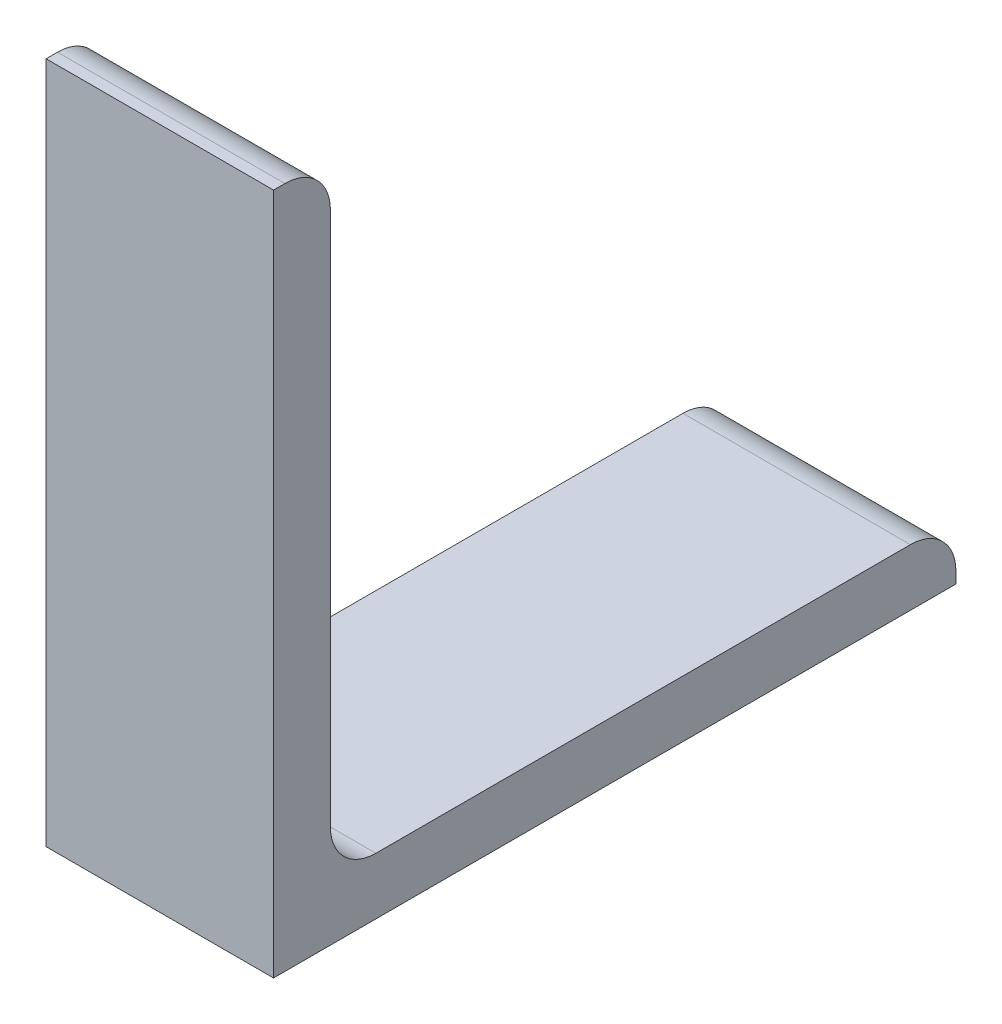
ISO-10303-21;
HEADER;
FILE_DESCRIPTION(('STEP AP214'),'2;1');
FILE_NAME('part.step','',(''),(''),'','','');
FILE_SCHEMA(('AUTOMOTIVE_DESIGN { 1 0 10303 214 1 1 1 1 }'));
ENDSEC;
DATA;
#1=APPLICATION_CONTEXT('core data for automotive mechanical design processes');
#2=APPLICATION_PROTOCOL_DEFINITION('international standard','automotive_design',2000,#1);
#3=PRODUCT_CONTEXT('',#1,'mechanical');
#4=PRODUCT('Part','Part','',(#3));
#5=PRODUCT_RELATED_PRODUCT_CATEGORY('part','',(#4));
#6=PRODUCT_DEFINITION_FORMATION('','',#4);
#7=PRODUCT_DEFINITION_CONTEXT('part definition',#1,'design');
#8=PRODUCT_DEFINITION('design','',#6,#7);
#9=PRODUCT_DEFINITION_SHAPE('','',#8);
#10=(LENGTH_UNIT() NAMED_UNIT(*) SI_UNIT(.MILLI.,.METRE.));
#11=(NAMED_UNIT(*) PLANE_ANGLE_UNIT() SI_UNIT($,.RADIAN.));
#12=(NAMED_UNIT(*) SI_UNIT($,.STERADIAN.) SOLID_ANGLE_UNIT());
#13=UNCERTAINTY_MEASURE_WITH_UNIT(LENGTH_MEASURE(1.E-05),#10,'distance_accuracy_value','');
#14=(GEOMETRIC_REPRESENTATION_CONTEXT(3) GLOBAL_UNCERTAINTY_ASSIGNED_CONTEXT((#13)) GLOBAL_UNIT_ASSIGNED_CONTEXT((#10,
#11,#12)) REPRESENTATION_CONTEXT('',''));
#15=CARTESIAN_POINT('',(0.,0.,0.));
#16=DIRECTION('',(0.,0.,1.));
#17=DIRECTION('',(1.,0.,0.));
#18=AXIS2_PLACEMENT_3D('',#15,#16,#17);
#19=CARTESIAN_POINT('',(-12.7,76.2,0.));
#20=DIRECTION('',(0.,1.,0.));
#21=DIRECTION('',(0.,0.,1.));
#22=AXIS2_PLACEMENT_3D('',#19,#20,#21);
#23=PLANE('',#22);
#24=DIRECTION('',(1.,0.,0.));
#25=VECTOR('',#24,1.);
#26=CARTESIAN_POINT('',(-12.7,76.2,0.));
#27=LINE('',#26,#25);
#28=CARTESIAN_POINT('',(-12.7,76.2,0.));
#29=VERTEX_POINT('',#28);
#30=CARTESIAN_POINT('',(12.7,76.2,0.));
#31=VERTEX_POINT('',#30);
#32=EDGE_CURVE('E35',#29,#31,#27,.T.);
#33=ORIENTED_EDGE('',*,*,#32,.T.);
#34=DIRECTION('',(0.,0.,1.));
#35=VECTOR('',#34,1.);
#36=CARTESIAN_POINT('',(12.7,76.2,0.));
#37=LINE('',#36,#35);
#38=CARTESIAN_POINT('',(12.7,76.2,-1.26999999999996));
#39=VERTEX_POINT('',#38);
#40=EDGE_CURVE('E102',#39,#31,#37,.T.);
#41=ORIENTED_EDGE('',*,*,#40,.F.);
#42=DIRECTION('',(1.,0.,0.));
#43=VECTOR('',#42,1.);
#44=CARTESIAN_POINT('',(-12.7,76.2,-1.26999999999996));
#45=LINE('',#44,#43);
#46=CARTESIAN_POINT('',(-12.7,76.2,-1.26999999999996));
#47=VERTEX_POINT('',#46);
#48=EDGE_CURVE('E11',#47,#39,#45,.T.);
#49=ORIENTED_EDGE('',*,*,#48,.F.);
#50=DIRECTION('',(0.,0.,1.));
#51=VECTOR('',#50,1.);
#52=CARTESIAN_POINT('',(-12.7,76.2,0.));
#53=LINE('',#52,#51);
#54=EDGE_CURVE('E103',#47,#29,#53,.T.);
#55=ORIENTED_EDGE('',*,*,#54,.T.);
#56=EDGE_LOOP('',(#33,#41,#49,#55));
#57=FACE_BOUND('',#56,.T.);
#58=ADVANCED_FACE('F32',(#57),#23,.T.);
#59=CARTESIAN_POINT('',(-12.7,71.12,-1.27));
#60=DIRECTION('',(1.,0.,0.));
#61=DIRECTION('',(0.,0.,-1.));
#62=AXIS2_PLACEMENT_3D('',#59,#60,#61);
#63=CYLINDRICAL_SURFACE('',#62,5.08);
#64=ORIENTED_EDGE('',*,*,#48,.T.);
#65=CARTESIAN_POINT('',(12.7,71.12,-1.27));
#66=DIRECTION('',(1.,0.,0.));
#67=DIRECTION('',(0.,0.,-1.));
#68=AXIS2_PLACEMENT_3D('',#65,#66,#67);
#69=CIRCLE('',#68,5.08);
#70=CARTESIAN_POINT('',(12.7,71.12,-6.35));
#71=VERTEX_POINT('',#70);
#72=EDGE_CURVE('E120',#71,#39,#69,.T.);
#73=ORIENTED_EDGE('',*,*,#72,.F.);
#74=DIRECTION('',(1.,0.,0.));
#75=VECTOR('',#74,1.);
#76=CARTESIAN_POINT('',(-12.7,71.12,-6.35));
#77=LINE('',#76,#75);
#78=CARTESIAN_POINT('',(-12.7,71.12,-6.35));
#79=VERTEX_POINT('',#78);
#80=EDGE_CURVE('E40',#79,#71,#77,.T.);
#81=ORIENTED_EDGE('',*,*,#80,.F.);
#82=CARTESIAN_POINT('',(-12.7,71.12,-1.27));
#83=DIRECTION('',(1.,0.,0.));
#84=DIRECTION('',(0.,0.,-1.));
#85=AXIS2_PLACEMENT_3D('',#82,#83,#84);
#86=CIRCLE('',#85,5.08);
#87=EDGE_CURVE('E108',#79,#47,#86,.T.);
#88=ORIENTED_EDGE('',*,*,#87,.T.);
#89=EDGE_LOOP('',(#64,#73,#81,#88));
#90=FACE_BOUND('',#89,.T.);
#91=ADVANCED_FACE('F196',(#90),#63,.T.);
#92=CARTESIAN_POINT('',(-12.7,71.12,-6.35));
#93=DIRECTION('',(0.,0.,-1.));
#94=DIRECTION('',(-1.,0.,0.));
#95=AXIS2_PLACEMENT_3D('',#92,#93,#94);
#96=PLANE('',#95);
#97=ORIENTED_EDGE('',*,*,#80,.T.);
#98=DIRECTION('',(0.,1.,0.));
#99=VECTOR('',#98,1.);
#100=CARTESIAN_POINT('',(12.7,71.12,-6.35));
#101=LINE('',#100,#99);
#102=CARTESIAN_POINT('',(12.7,11.43,-6.35));
#103=VERTEX_POINT('',#102);
#104=EDGE_CURVE('E136',#103,#71,#101,.T.);
#105=ORIENTED_EDGE('',*,*,#104,.F.);
#106=DIRECTION('',(1.,0.,0.));
#107=VECTOR('',#106,1.);
#108=CARTESIAN_POINT('',(-12.7,11.43,-6.35));
#109=LINE('',#108,#107);
#110=CARTESIAN_POINT('',(-12.7,11.43,-6.35));
#111=VERTEX_POINT('',#110);
#112=EDGE_CURVE('E161',#111,#103,#109,.T.);
#113=ORIENTED_EDGE('',*,*,#112,.F.);
#114=DIRECTION('',(0.,1.,0.));
#115=VECTOR('',#114,1.);
#116=CARTESIAN_POINT('',(-12.7,71.12,-6.35));
#117=LINE('',#116,#115);
#118=EDGE_CURVE('E157',#111,#79,#117,.T.);
#119=ORIENTED_EDGE('',*,*,#118,.T.);
#120=EDGE_LOOP('',(#97,#105,#113,#119));
#121=FACE_BOUND('',#120,.T.);
#122=ADVANCED_FACE('F194',(#121),#96,.T.);
#123=CARTESIAN_POINT('',(-12.7,11.43,-11.43));
#124=DIRECTION('',(1.,0.,0.));
#125=DIRECTION('',(0.,0.,-1.));
#126=AXIS2_PLACEMENT_3D('',#123,#124,#125);
#127=CYLINDRICAL_SURFACE('',#126,5.08);
#128=ORIENTED_EDGE('',*,*,#112,.T.);
#129=CARTESIAN_POINT('',(12.7,11.43,-11.43));
#130=DIRECTION('',(-1.,0.,0.));
#131=DIRECTION('',(0.,0.,-1.));
#132=AXIS2_PLACEMENT_3D('',#129,#130,#131);
#133=CIRCLE('',#132,5.08);
#134=CARTESIAN_POINT('',(12.7,6.35,-11.43));
#135=VERTEX_POINT('',#134);
#136=EDGE_CURVE('E133',#135,#103,#133,.T.);
#137=ORIENTED_EDGE('',*,*,#136,.F.);
#138=DIRECTION('',(1.,0.,0.));
#139=VECTOR('',#138,1.);
#140=CARTESIAN_POINT('',(-12.7,6.35,-11.43));
#141=LINE('',#140,#139);
#142=CARTESIAN_POINT('',(-12.7,6.35,-11.43));
#143=VERTEX_POINT('',#142);
#144=EDGE_CURVE('E163',#143,#135,#141,.T.);
#145=ORIENTED_EDGE('',*,*,#144,.F.);
#146=CARTESIAN_POINT('',(-12.7,11.43,-11.43));
#147=DIRECTION('',(-1.,0.,0.));
#148=DIRECTION('',(0.,0.,-1.));
#149=AXIS2_PLACEMENT_3D('',#146,#147,#148);
#150=CIRCLE('',#149,5.08);
#151=EDGE_CURVE('E154',#143,#111,#150,.T.);
#152=ORIENTED_EDGE('',*,*,#151,.T.);
#153=EDGE_LOOP('',(#128,#137,#145,#152));
#154=FACE_BOUND('',#153,.T.);
#155=ADVANCED_FACE('F192',(#154),#127,.F.);
#156=CARTESIAN_POINT('',(-12.7,6.35,-11.43));
#157=DIRECTION('',(0.,1.,0.));
#158=DIRECTION('',(0.,0.,1.));
#159=AXIS2_PLACEMENT_3D('',#156,#157,#158);
#160=PLANE('',#159);
#161=ORIENTED_EDGE('',*,*,#144,.T.);
#162=DIRECTION('',(0.,0.,1.));
#163=VECTOR('',#162,1.);
#164=CARTESIAN_POINT('',(12.7,6.35,-11.43));
#165=LINE('',#164,#163);
#166=CARTESIAN_POINT('',(12.7,6.35,-71.12));
#167=VERTEX_POINT('',#166);
#168=EDGE_CURVE('E130',#167,#135,#165,.T.);
#169=ORIENTED_EDGE('',*,*,#168,.F.);
#170=DIRECTION('',(1.,0.,0.));
#171=VECTOR('',#170,1.);
#172=CARTESIAN_POINT('',(-12.7,6.35,-71.12));
#173=LINE('',#172,#171);
#174=CARTESIAN_POINT('',(-12.7,6.35,-71.12));
#175=VERTEX_POINT('',#174);
#176=EDGE_CURVE('E165',#175,#167,#173,.T.);
#177=ORIENTED_EDGE('',*,*,#176,.F.);
#178=DIRECTION('',(0.,0.,1.));
#179=VECTOR('',#178,1.);
#180=CARTESIAN_POINT('',(-12.7,6.35,-11.43));
#181=LINE('',#180,#179);
#182=EDGE_CURVE('E151',#175,#143,#181,.T.);
#183=ORIENTED_EDGE('',*,*,#182,.T.);
#184=EDGE_LOOP('',(#161,#169,#177,#183));
#185=FACE_BOUND('',#184,.T.);
#186=ADVANCED_FACE('F187',(#185),#160,.T.);
#187=CARTESIAN_POINT('',(-12.7,1.27,-71.12));
#188=DIRECTION('',(1.,0.,0.));
#189=DIRECTION('',(0.,0.,-1.));
#190=AXIS2_PLACEMENT_3D('',#187,#188,#189);
#191=CYLINDRICAL_SURFACE('',#190,5.08);
#192=ORIENTED_EDGE('',*,*,#176,.T.);
#193=CARTESIAN_POINT('',(12.7,1.27,-71.12));
#194=DIRECTION('',(1.,0.,0.));
#195=DIRECTION('',(0.,0.,1.));
#196=AXIS2_PLACEMENT_3D('',#193,#194,#195);
#197=CIRCLE('',#196,5.08);
#198=CARTESIAN_POINT('',(12.7,1.26999999999996,-76.2));
#199=VERTEX_POINT('',#198);
#200=EDGE_CURVE('E127',#199,#167,#197,.T.);
#201=ORIENTED_EDGE('',*,*,#200,.F.);
#202=DIRECTION('',(1.,0.,0.));
#203=VECTOR('',#202,1.);
#204=CARTESIAN_POINT('',(-12.7,1.26999999999996,-76.2));
#205=LINE('',#204,#203);
#206=CARTESIAN_POINT('',(-12.7,1.26999999999996,-76.2));
#207=VERTEX_POINT('',#206);
#208=EDGE_CURVE('E167',#207,#199,#205,.T.);
#209=ORIENTED_EDGE('',*,*,#208,.F.);
#210=CARTESIAN_POINT('',(-12.7,1.27,-71.12));
#211=DIRECTION('',(1.,0.,0.));
#212=DIRECTION('',(0.,0.,1.));
#213=AXIS2_PLACEMENT_3D('',#210,#211,#212);
#214=CIRCLE('',#213,5.08);
#215=EDGE_CURVE('E148',#207,#175,#214,.T.);
#216=ORIENTED_EDGE('',*,*,#215,.T.);
#217=EDGE_LOOP('',(#192,#201,#209,#216));
#218=FACE_BOUND('',#217,.T.);
#219=ADVANCED_FACE('F180',(#218),#191,.T.);
#220=CARTESIAN_POINT('',(-12.7,1.26999999999996,-76.2));
#221=DIRECTION('',(0.,0.,-1.));
#222=DIRECTION('',(-1.,0.,0.));
#223=AXIS2_PLACEMENT_3D('',#220,#221,#222);
#224=PLANE('',#223);
#225=ORIENTED_EDGE('',*,*,#208,.T.);
#226=DIRECTION('',(0.,1.,0.));
#227=VECTOR('',#226,1.);
#228=CARTESIAN_POINT('',(12.7,1.26999999999996,-76.2));
#229=LINE('',#228,#227);
#230=CARTESIAN_POINT('',(12.7,0.,-76.2));
#231=VERTEX_POINT('',#230);
#232=EDGE_CURVE('E124',#231,#199,#229,.T.);
#233=ORIENTED_EDGE('',*,*,#232,.F.);
#234=DIRECTION('',(1.,0.,0.));
#235=VECTOR('',#234,1.);
#236=CARTESIAN_POINT('',(-12.7,0.,-76.2));
#237=LINE('',#236,#235);
#238=CARTESIAN_POINT('',(-12.7,0.,-76.2));
#239=VERTEX_POINT('',#238);
#240=EDGE_CURVE('E169',#239,#231,#237,.T.);
#241=ORIENTED_EDGE('',*,*,#240,.F.);
#242=DIRECTION('',(0.,1.,0.));
#243=VECTOR('',#242,1.);
#244=CARTESIAN_POINT('',(-12.7,1.26999999999996,-76.2));
#245=LINE('',#244,#243);
#246=EDGE_CURVE('E145',#239,#207,#245,.T.);
#247=ORIENTED_EDGE('',*,*,#246,.T.);
#248=EDGE_LOOP('',(#225,#233,#241,#247));
#249=FACE_BOUND('',#248,.T.);
#250=ADVANCED_FACE('F177',(#249),#224,.T.);
#251=CARTESIAN_POINT('',(-12.7,0.,0.));
#252=DIRECTION('',(0.,-1.,0.));
#253=DIRECTION('',(0.,0.,-1.));
#254=AXIS2_PLACEMENT_3D('',#251,#252,#253);
#255=PLANE('',#254);
#256=ORIENTED_EDGE('',*,*,#240,.T.);
#257=DIRECTION('',(0.,0.,-1.));
#258=VECTOR('',#257,1.);
#259=CARTESIAN_POINT('',(12.7,0.,0.));
#260=LINE('',#259,#258);
#261=CARTESIAN_POINT('',(12.7,0.,0.));
#262=VERTEX_POINT('',#261);
#263=EDGE_CURVE('E115',#262,#231,#260,.T.);
#264=ORIENTED_EDGE('',*,*,#263,.F.);
#265=DIRECTION('',(1.,0.,0.));
#266=VECTOR('',#265,1.);
#267=CARTESIAN_POINT('',(-12.7,0.,0.));
#268=LINE('',#267,#266);
#269=CARTESIAN_POINT('',(-12.7,0.,0.));
#270=VERTEX_POINT('',#269);
#271=EDGE_CURVE('E107',#270,#262,#268,.T.);
#272=ORIENTED_EDGE('',*,*,#271,.F.);
#273=DIRECTION('',(0.,0.,-1.));
#274=VECTOR('',#273,1.);
#275=CARTESIAN_POINT('',(-12.7,0.,0.));
#276=LINE('',#275,#274);
#277=EDGE_CURVE('E142',#270,#239,#276,.T.);
#278=ORIENTED_EDGE('',*,*,#277,.T.);
#279=EDGE_LOOP('',(#256,#264,#272,#278));
#280=FACE_BOUND('',#279,.T.);
#281=ADVANCED_FACE('F171',(#280),#255,.T.);
#282=CARTESIAN_POINT('',(-12.7,76.2,0.));
#283=DIRECTION('',(0.,0.,1.));
#284=DIRECTION('',(1.,0.,0.));
#285=AXIS2_PLACEMENT_3D('',#282,#283,#284);
#286=PLANE('',#285);
#287=ORIENTED_EDGE('',*,*,#271,.T.);
#288=DIRECTION('',(0.,-1.,0.));
#289=VECTOR('',#288,1.);
#290=CARTESIAN_POINT('',(12.7,76.2,0.));
#291=LINE('',#290,#289);
#292=EDGE_CURVE('E110',#31,#262,#291,.T.);
#293=ORIENTED_EDGE('',*,*,#292,.F.);
#294=ORIENTED_EDGE('',*,*,#32,.F.);
#295=DIRECTION('',(0.,-1.,0.));
#296=VECTOR('',#295,1.);
#297=CARTESIAN_POINT('',(-12.7,76.2,0.));
#298=LINE('',#297,#296);
#299=EDGE_CURVE('E140',#29,#270,#298,.T.);
#300=ORIENTED_EDGE('',*,*,#299,.T.);
#301=EDGE_LOOP('',(#287,#293,#294,#300));
#302=FACE_BOUND('',#301,.T.);
#303=ADVANCED_FACE('F111',(#302),#286,.T.);
#304=CARTESIAN_POINT('',(-12.7,71.12,-1.27));
#305=DIRECTION('',(1.,0.,0.));
#306=DIRECTION('',(0.,0.,-1.));
#307=AXIS2_PLACEMENT_3D('',#304,#305,#306);
#308=PLANE('',#307);
#309=ORIENTED_EDGE('',*,*,#54,.F.);
#310=ORIENTED_EDGE('',*,*,#87,.F.);
#311=ORIENTED_EDGE('',*,*,#118,.F.);
#312=ORIENTED_EDGE('',*,*,#151,.F.);
#313=ORIENTED_EDGE('',*,*,#182,.F.);
#314=ORIENTED_EDGE('',*,*,#215,.F.);
#315=ORIENTED_EDGE('',*,*,#246,.F.);
#316=ORIENTED_EDGE('',*,*,#277,.F.);
#317=ORIENTED_EDGE('',*,*,#299,.F.);
#318=EDGE_LOOP('',(#309,#310,#311,#312,#313,#314,#315,#316,#317));
#319=FACE_BOUND('',#318,.T.);
#320=ADVANCED_FACE('F183',(#319),#308,.F.);
#321=CARTESIAN_POINT('',(12.7,71.12,-1.27));
#322=DIRECTION('',(1.,0.,0.));
#323=DIRECTION('',(0.,0.,-1.));
#324=AXIS2_PLACEMENT_3D('',#321,#322,#323);
#325=PLANE('',#324);
#326=ORIENTED_EDGE('',*,*,#40,.T.);
#327=ORIENTED_EDGE('',*,*,#292,.T.);
#328=ORIENTED_EDGE('',*,*,#263,.T.);
#329=ORIENTED_EDGE('',*,*,#232,.T.);
#330=ORIENTED_EDGE('',*,*,#200,.T.);
#331=ORIENTED_EDGE('',*,*,#168,.T.);
#332=ORIENTED_EDGE('',*,*,#136,.T.);
#333=ORIENTED_EDGE('',*,*,#104,.T.);
#334=ORIENTED_EDGE('',*,*,#72,.T.);
#335=EDGE_LOOP('',(#326,#327,#328,#329,#330,#331,#332,#333,#334));
#336=FACE_BOUND('',#335,.T.);
#337=ADVANCED_FACE('F118',(#336),#325,.T.);
#338=CLOSED_SHELL('',(#58,#91,#122,#155,#186,#219,#250,#281,#303,#320,#337));
#339=MANIFOLD_SOLID_BREP('B2',#338);
#340=ADVANCED_BREP_SHAPE_REPRESENTATION('',(#18,#339),#14);
#341=SHAPE_DEFINITION_REPRESENTATION(#9,#340);
ENDSEC;
END-ISO-10303-21;
